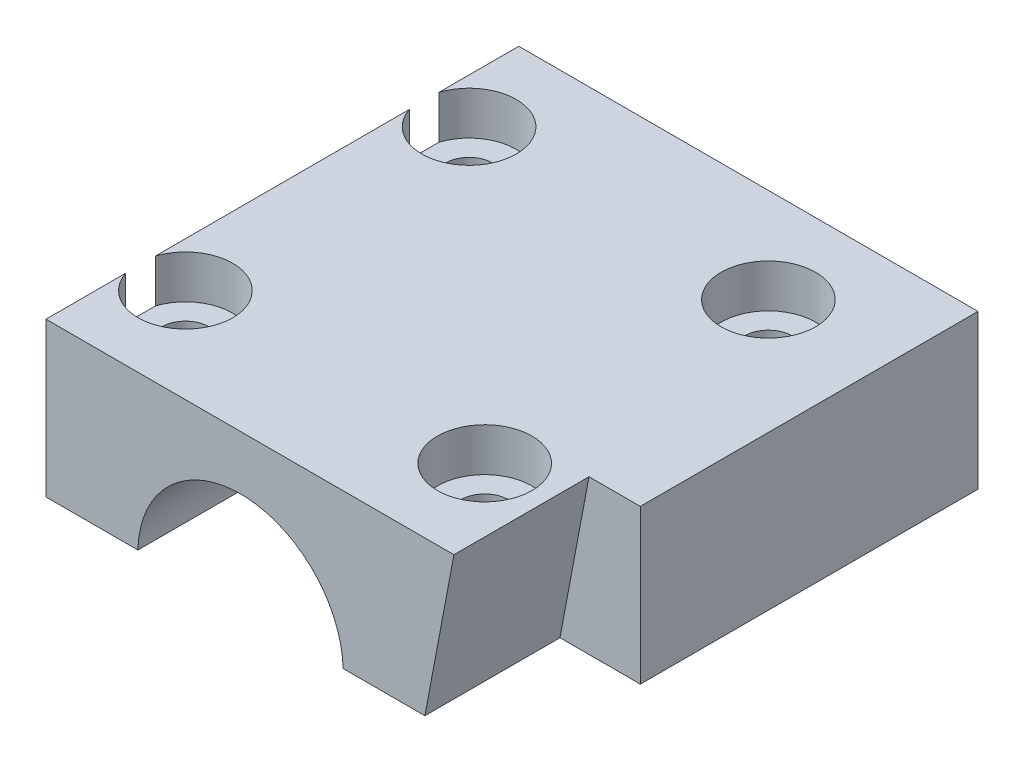
ISO-10303-21;
HEADER;
FILE_DESCRIPTION(('STEP AP214'),'2;1');
FILE_NAME('part.step','',(''),(''),'','','');
FILE_SCHEMA(('AUTOMOTIVE_DESIGN { 1 0 10303 214 1 1 1 1 }'));
ENDSEC;
DATA;
#1=APPLICATION_CONTEXT('core data for automotive mechanical design processes');
#2=APPLICATION_PROTOCOL_DEFINITION('international standard','automotive_design',2000,#1);
#3=PRODUCT_CONTEXT('',#1,'mechanical');
#4=PRODUCT('Part','Part','',(#3));
#5=PRODUCT_RELATED_PRODUCT_CATEGORY('part','',(#4));
#6=PRODUCT_DEFINITION_FORMATION('','',#4);
#7=PRODUCT_DEFINITION_CONTEXT('part definition',#1,'design');
#8=PRODUCT_DEFINITION('design','',#6,#7);
#9=PRODUCT_DEFINITION_SHAPE('','',#8);
#10=(LENGTH_UNIT() NAMED_UNIT(*) SI_UNIT(.MILLI.,.METRE.));
#11=(NAMED_UNIT(*) PLANE_ANGLE_UNIT() SI_UNIT($,.RADIAN.));
#12=(NAMED_UNIT(*) SI_UNIT($,.STERADIAN.) SOLID_ANGLE_UNIT());
#13=UNCERTAINTY_MEASURE_WITH_UNIT(LENGTH_MEASURE(1.E-05),#10,'distance_accuracy_value','');
#14=(GEOMETRIC_REPRESENTATION_CONTEXT(3) GLOBAL_UNCERTAINTY_ASSIGNED_CONTEXT((#13)) GLOBAL_UNIT_ASSIGNED_CONTEXT((#10,
#11,#12)) REPRESENTATION_CONTEXT('',''));
#15=CARTESIAN_POINT('',(0.,0.,0.));
#16=DIRECTION('',(0.,0.,1.));
#17=DIRECTION('',(1.,0.,0.));
#18=AXIS2_PLACEMENT_3D('',#15,#16,#17);
#19=CARTESIAN_POINT('',(149.649998,-25.85,-70.));
#20=DIRECTION('',(0.,0.,-1.));
#21=DIRECTION('',(-1.,0.,0.));
#22=AXIS2_PLACEMENT_3D('',#19,#20,#21);
#23=PLANE('',#22);
#24=CARTESIAN_POINT('',(147.049995999999,-31.65,-70.));
#25=DIRECTION('',(0.,0.,-1.));
#26=DIRECTION('',(-1.,0.,0.));
#27=AXIS2_PLACEMENT_3D('',#24,#25,#26);
#28=CIRCLE('',#27,7.6);
#29=CARTESIAN_POINT('',(139.452628034693,-31.4500000000005,-70.));
#30=VERTEX_POINT('',#29);
#31=CARTESIAN_POINT('',(154.647363965306,-31.4500000000006,-70.));
#32=VERTEX_POINT('',#31);
#33=EDGE_CURVE('E151',#30,#32,#28,.T.);
#34=ORIENTED_EDGE('',*,*,#33,.F.);
#35=DIRECTION('',(1.,0.,0.));
#36=VECTOR('',#35,1.);
#37=CARTESIAN_POINT('',(144.549997,-31.45,-70.));
#38=LINE('',#37,#36);
#39=CARTESIAN_POINT('',(132.65,-31.45,-70.));
#40=VERTEX_POINT('',#39);
#41=EDGE_CURVE('E276',#40,#30,#38,.T.);
#42=ORIENTED_EDGE('',*,*,#41,.F.);
#43=DIRECTION('',(0.,-1.,0.));
#44=VECTOR('',#43,1.);
#45=CARTESIAN_POINT('',(132.65,-28.75,-70.));
#46=LINE('',#45,#44);
#47=CARTESIAN_POINT('',(132.65,-20.05,-70.));
#48=VERTEX_POINT('',#47);
#49=EDGE_CURVE('E211',#48,#40,#46,.T.);
#50=ORIENTED_EDGE('',*,*,#49,.F.);
#51=DIRECTION('',(-1.,0.,0.));
#52=VECTOR('',#51,1.);
#53=CARTESIAN_POINT('',(141.149999,-20.05,-70.));
#54=LINE('',#53,#52);
#55=CARTESIAN_POINT('',(166.649995999999,-20.05,-70.));
#56=VERTEX_POINT('',#55);
#57=EDGE_CURVE('E229',#56,#48,#54,.T.);
#58=ORIENTED_EDGE('',*,*,#57,.F.);
#59=DIRECTION('',(0.,1.,0.));
#60=VECTOR('',#59,1.);
#61=CARTESIAN_POINT('',(166.649995999999,-22.95,-70.));
#62=LINE('',#61,#60);
#63=CARTESIAN_POINT('',(166.649995999999,-31.45,-70.));
#64=VERTEX_POINT('',#63);
#65=EDGE_CURVE('E207',#64,#56,#62,.T.);
#66=ORIENTED_EDGE('',*,*,#65,.F.);
#67=DIRECTION('',(1.,0.,0.));
#68=VECTOR('',#67,1.);
#69=CARTESIAN_POINT('',(158.149997,-31.45,-70.));
#70=LINE('',#69,#68);
#71=EDGE_CURVE('E11',#32,#64,#70,.T.);
#72=ORIENTED_EDGE('',*,*,#71,.F.);
#73=EDGE_LOOP('',(#34,#42,#50,#58,#66,#72));
#74=FACE_BOUND('',#73,.T.);
#75=ADVANCED_FACE('F17',(#74),#23,.T.);
#76=CARTESIAN_POINT('',(149.649998,-54.825,-34.9999999903543));
#77=DIRECTION('',(0.,0.,1.));
#78=DIRECTION('',(1.,0.,0.));
#79=AXIS2_PLACEMENT_3D('',#76,#77,#78);
#80=PLANE('',#79);
#81=DIRECTION('',(0.185269040092225,0.982687835878366,0.));
#82=VECTOR('',#81,1.);
#83=CARTESIAN_POINT('',(158.383219098092,-43.7422873077023,-34.9999999903544));
#84=LINE('',#83,#82);
#85=CARTESIAN_POINT('',(160.700720329803,-31.45,-34.9999999903346));
#86=VERTEX_POINT('',#85);
#87=CARTESIAN_POINT('',(162.849996,-20.05,-34.9999999903347));
#88=VERTEX_POINT('',#87);
#89=EDGE_CURVE('E350',#86,#88,#84,.T.);
#90=ORIENTED_EDGE('',*,*,#89,.T.);
#91=DIRECTION('',(-1.,0.,0.));
#92=VECTOR('',#91,1.);
#93=CARTESIAN_POINT('',(166.649996,-20.05,-35.));
#94=LINE('',#93,#92);
#95=CARTESIAN_POINT('',(132.65,-20.05,-35.));
#96=VERTEX_POINT('',#95);
#97=EDGE_CURVE('E260',#88,#96,#94,.T.);
#98=ORIENTED_EDGE('',*,*,#97,.T.);
#99=DIRECTION('',(0.,-1.,0.));
#100=VECTOR('',#99,1.);
#101=CARTESIAN_POINT('',(132.65,-20.05,-35.));
#102=LINE('',#101,#100);
#103=CARTESIAN_POINT('',(132.65,-31.45,-35.));
#104=VERTEX_POINT('',#103);
#105=EDGE_CURVE('E238',#96,#104,#102,.T.);
#106=ORIENTED_EDGE('',*,*,#105,.T.);
#107=DIRECTION('',(-1.,0.,0.));
#108=VECTOR('',#107,1.);
#109=CARTESIAN_POINT('',(144.549997,-31.45,-34.9999999903543));
#110=LINE('',#109,#108);
#111=CARTESIAN_POINT('',(139.452628034693,-31.4500000000005,-35.));
#112=VERTEX_POINT('',#111);
#113=EDGE_CURVE('E252',#112,#104,#110,.T.);
#114=ORIENTED_EDGE('',*,*,#113,.F.);
#115=CARTESIAN_POINT('',(147.049996,-31.65,-35.));
#116=DIRECTION('',(0.,0.,1.));
#117=DIRECTION('',(-1.,0.,0.));
#118=AXIS2_PLACEMENT_3D('',#115,#116,#117);
#119=CIRCLE('',#118,7.6);
#120=CARTESIAN_POINT('',(154.647363965306,-31.4500000000006,-35.));
#121=VERTEX_POINT('',#120);
#122=EDGE_CURVE('E140',#121,#112,#119,.T.);
#123=ORIENTED_EDGE('',*,*,#122,.F.);
#124=DIRECTION('',(1.,0.,0.));
#125=VECTOR('',#124,1.);
#126=CARTESIAN_POINT('',(158.149997,-31.45,-34.9999999903544));
#127=LINE('',#126,#125);
#128=EDGE_CURVE('E28',#121,#86,#127,.T.);
#129=ORIENTED_EDGE('',*,*,#128,.T.);
#130=EDGE_LOOP('',(#90,#98,#106,#114,#123,#129));
#131=FACE_BOUND('',#130,.T.);
#132=ADVANCED_FACE('F19',(#131),#80,.T.);
#133=CARTESIAN_POINT('',(166.649996,-31.45,-35.));
#134=DIRECTION('',(0.,-1.,0.));
#135=DIRECTION('',(-1.,0.,0.));
#136=AXIS2_PLACEMENT_3D('',#133,#134,#135);
#137=PLANE('',#136);
#138=CARTESIAN_POINT('',(158.128590856567,-31.45,-42.));
#139=DIRECTION('',(0.,1.,0.));
#140=DIRECTION('',(-1.,0.,0.));
#141=AXIS2_PLACEMENT_3D('',#138,#139,#140);
#142=CIRCLE('',#141,1.75);
#143=CARTESIAN_POINT('',(159.878590856567,-31.45,-42.));
#144=VERTEX_POINT('',#143);
#145=EDGE_CURVE('E321',#144,#144,#142,.T.);
#146=ORIENTED_EDGE('',*,*,#145,.T.);
#147=EDGE_LOOP('',(#146));
#148=FACE_BOUND('',#147,.T.);
#149=CARTESIAN_POINT('',(158.128590856568,-31.45,-63.));
#150=DIRECTION('',(0.,1.,0.));
#151=DIRECTION('',(-1.,0.,0.));
#152=AXIS2_PLACEMENT_3D('',#149,#150,#151);
#153=CIRCLE('',#152,1.75);
#154=CARTESIAN_POINT('',(159.878590856568,-31.45,-63.));
#155=VERTEX_POINT('',#154);
#156=EDGE_CURVE('E251',#155,#155,#153,.T.);
#157=ORIENTED_EDGE('',*,*,#156,.T.);
#158=EDGE_LOOP('',(#157));
#159=FACE_BOUND('',#158,.T.);
#160=DIRECTION('',(0.,0.,1.));
#161=VECTOR('',#160,1.);
#162=CARTESIAN_POINT('',(160.700720329803,-31.45,-34.9999999951673));
#163=LINE('',#162,#161);
#164=CARTESIAN_POINT('',(160.700720329802,-31.45,-44.9999999903346));
#165=VERTEX_POINT('',#164);
#166=EDGE_CURVE('E354',#165,#86,#163,.T.);
#167=ORIENTED_EDGE('',*,*,#166,.T.);
#168=ORIENTED_EDGE('',*,*,#128,.F.);
#169=DIRECTION('',(0.,0.,-1.));
#170=VECTOR('',#169,1.);
#171=CARTESIAN_POINT('',(154.647363965289,-31.45,-35.));
#172=LINE('',#171,#170);
#173=EDGE_CURVE('E283',#121,#32,#172,.T.);
#174=ORIENTED_EDGE('',*,*,#173,.T.);
#175=ORIENTED_EDGE('',*,*,#71,.T.);
#176=DIRECTION('',(0.,0.,-1.));
#177=VECTOR('',#176,1.);
#178=CARTESIAN_POINT('',(166.649996,-31.45,-35.));
#179=LINE('',#178,#177);
#180=CARTESIAN_POINT('',(166.649996000001,-31.45,-44.999999990335));
#181=VERTEX_POINT('',#180);
#182=EDGE_CURVE('E286',#181,#64,#179,.T.);
#183=ORIENTED_EDGE('',*,*,#182,.F.);
#184=DIRECTION('',(-1.,0.,0.));
#185=VECTOR('',#184,1.);
#186=CARTESIAN_POINT('',(223.31267608245,-31.45,-44.9999999903389));
#187=LINE('',#186,#185);
#188=EDGE_CURVE('E223',#181,#165,#187,.T.);
#189=ORIENTED_EDGE('',*,*,#188,.T.);
#190=EDGE_LOOP('',(#167,#168,#174,#175,#183,#189));
#191=FACE_BOUND('',#190,.T.);
#192=ADVANCED_FACE('F395',(#148,#159,#191),#137,.T.);
#193=CARTESIAN_POINT('',(147.049996,-31.65,-35.));
#194=DIRECTION('',(0.,0.,-1.));
#195=DIRECTION('',(-1.,0.,0.));
#196=AXIS2_PLACEMENT_3D('',#193,#194,#195);
#197=CYLINDRICAL_SURFACE('',#196,7.6);
#198=ORIENTED_EDGE('',*,*,#33,.T.);
#199=ORIENTED_EDGE('',*,*,#173,.F.);
#200=ORIENTED_EDGE('',*,*,#122,.T.);
#201=DIRECTION('',(0.,0.,-1.));
#202=VECTOR('',#201,1.);
#203=CARTESIAN_POINT('',(139.452628034711,-31.45,-35.));
#204=LINE('',#203,#202);
#205=EDGE_CURVE('E254',#112,#30,#204,.T.);
#206=ORIENTED_EDGE('',*,*,#205,.T.);
#207=EDGE_LOOP('',(#198,#199,#200,#206));
#208=FACE_BOUND('',#207,.T.);
#209=ADVANCED_FACE('F409',(#208),#197,.F.);
#210=CARTESIAN_POINT('',(139.449996,-31.45,-35.));
#211=DIRECTION('',(0.,-1.,0.));
#212=DIRECTION('',(-1.,0.,0.));
#213=AXIS2_PLACEMENT_3D('',#210,#211,#212);
#214=PLANE('',#213);
#215=CARTESIAN_POINT('',(135.971401143432,-31.45,-42.0000000000016));
#216=DIRECTION('',(0.,1.,0.));
#217=DIRECTION('',(-1.,0.,0.));
#218=AXIS2_PLACEMENT_3D('',#215,#216,#217);
#219=CIRCLE('',#218,1.75);
#220=CARTESIAN_POINT('',(137.721401143432,-31.45,-42.0000000000016));
#221=VERTEX_POINT('',#220);
#222=EDGE_CURVE('E280',#221,#221,#219,.T.);
#223=ORIENTED_EDGE('',*,*,#222,.T.);
#224=EDGE_LOOP('',(#223));
#225=FACE_BOUND('',#224,.T.);
#226=CARTESIAN_POINT('',(135.971401143431,-31.45,-63.));
#227=DIRECTION('',(0.,1.,0.));
#228=DIRECTION('',(-1.,0.,0.));
#229=AXIS2_PLACEMENT_3D('',#226,#227,#228);
#230=CIRCLE('',#229,1.75);
#231=CARTESIAN_POINT('',(137.721401143431,-31.45,-63.));
#232=VERTEX_POINT('',#231);
#233=EDGE_CURVE('E316',#232,#232,#230,.T.);
#234=ORIENTED_EDGE('',*,*,#233,.T.);
#235=EDGE_LOOP('',(#234));
#236=FACE_BOUND('',#235,.T.);
#237=ORIENTED_EDGE('',*,*,#41,.T.);
#238=ORIENTED_EDGE('',*,*,#205,.F.);
#239=ORIENTED_EDGE('',*,*,#113,.T.);
#240=DIRECTION('',(0.,0.,-1.));
#241=VECTOR('',#240,1.);
#242=CARTESIAN_POINT('',(132.65,-31.45,-35.));
#243=LINE('',#242,#241);
#244=EDGE_CURVE('E234',#104,#40,#243,.T.);
#245=ORIENTED_EDGE('',*,*,#244,.T.);
#246=EDGE_LOOP('',(#237,#238,#239,#245));
#247=FACE_BOUND('',#246,.T.);
#248=ADVANCED_FACE('F411',(#225,#236,#247),#214,.T.);
#249=CARTESIAN_POINT('',(135.971401143432,-20.05,-42.0000000000016));
#250=DIRECTION('',(0.,-1.,0.));
#251=DIRECTION('',(-1.,0.,0.));
#252=AXIS2_PLACEMENT_3D('',#249,#250,#251);
#253=CYLINDRICAL_SURFACE('',#252,1.75);
#254=CARTESIAN_POINT('',(135.971401143432,-23.2499953703008,-42.0000000000016));
#255=DIRECTION('',(0.,1.,0.));
#256=DIRECTION('',(-1.,0.,0.));
#257=AXIS2_PLACEMENT_3D('',#254,#255,#256);
#258=CIRCLE('',#257,1.75);
#259=CARTESIAN_POINT('',(137.721401143432,-23.25,-42.0000000000016));
#260=VERTEX_POINT('',#259);
#261=EDGE_CURVE('E270',#260,#260,#258,.T.);
#262=ORIENTED_EDGE('',*,*,#261,.T.);
#263=DIRECTION('',(0.,-1.,0.));
#264=VECTOR('',#263,1.);
#265=CARTESIAN_POINT('',(137.721401143432,-20.05,-42.0000000000016));
#266=LINE('',#265,#264);
#267=EDGE_CURVE('E312',#260,#221,#266,.T.);
#268=ORIENTED_EDGE('',*,*,#267,.T.);
#269=ORIENTED_EDGE('',*,*,#222,.F.);
#270=ORIENTED_EDGE('',*,*,#267,.F.);
#271=EDGE_LOOP('',(#262,#268,#269,#270));
#272=FACE_BOUND('',#271,.T.);
#273=ADVANCED_FACE('F564',(#272),#253,.F.);
#274=CARTESIAN_POINT('',(135.971401143431,-20.05,-63.));
#275=DIRECTION('',(0.,-1.,0.));
#276=DIRECTION('',(-1.,0.,0.));
#277=AXIS2_PLACEMENT_3D('',#274,#275,#276);
#278=CYLINDRICAL_SURFACE('',#277,1.75);
#279=CARTESIAN_POINT('',(135.971401143431,-23.2499953703008,-63.));
#280=DIRECTION('',(0.,1.,0.));
#281=DIRECTION('',(-1.,0.,0.));
#282=AXIS2_PLACEMENT_3D('',#279,#280,#281);
#283=CIRCLE('',#282,1.75);
#284=CARTESIAN_POINT('',(137.721401143431,-23.25,-63.));
#285=VERTEX_POINT('',#284);
#286=EDGE_CURVE('E218',#285,#285,#283,.T.);
#287=ORIENTED_EDGE('',*,*,#286,.T.);
#288=DIRECTION('',(0.,-1.,0.));
#289=VECTOR('',#288,1.);
#290=CARTESIAN_POINT('',(137.721401143431,-20.05,-63.));
#291=LINE('',#290,#289);
#292=EDGE_CURVE('E344',#285,#232,#291,.T.);
#293=ORIENTED_EDGE('',*,*,#292,.T.);
#294=ORIENTED_EDGE('',*,*,#233,.F.);
#295=ORIENTED_EDGE('',*,*,#292,.F.);
#296=EDGE_LOOP('',(#287,#293,#294,#295));
#297=FACE_BOUND('',#296,.T.);
#298=ADVANCED_FACE('F558',(#297),#278,.F.);
#299=CARTESIAN_POINT('',(158.128590856567,-20.05,-42.));
#300=DIRECTION('',(0.,-1.,0.));
#301=DIRECTION('',(-1.,0.,0.));
#302=AXIS2_PLACEMENT_3D('',#299,#300,#301);
#303=CYLINDRICAL_SURFACE('',#302,1.75);
#304=CARTESIAN_POINT('',(158.128590856567,-23.2499953703008,-42.));
#305=DIRECTION('',(0.,1.,0.));
#306=DIRECTION('',(-1.,0.,0.));
#307=AXIS2_PLACEMENT_3D('',#304,#305,#306);
#308=CIRCLE('',#307,1.75);
#309=CARTESIAN_POINT('',(159.878590856567,-23.25,-42.));
#310=VERTEX_POINT('',#309);
#311=EDGE_CURVE('E324',#310,#310,#308,.T.);
#312=ORIENTED_EDGE('',*,*,#311,.T.);
#313=DIRECTION('',(0.,-1.,0.));
#314=VECTOR('',#313,1.);
#315=CARTESIAN_POINT('',(159.878590856567,-20.05,-42.));
#316=LINE('',#315,#314);
#317=EDGE_CURVE('E317',#310,#144,#316,.T.);
#318=ORIENTED_EDGE('',*,*,#317,.T.);
#319=ORIENTED_EDGE('',*,*,#145,.F.);
#320=ORIENTED_EDGE('',*,*,#317,.F.);
#321=EDGE_LOOP('',(#312,#318,#319,#320));
#322=FACE_BOUND('',#321,.T.);
#323=ADVANCED_FACE('F563',(#322),#303,.F.);
#324=CARTESIAN_POINT('',(158.128590856568,-20.05,-63.));
#325=DIRECTION('',(0.,-1.,0.));
#326=DIRECTION('',(-1.,0.,0.));
#327=AXIS2_PLACEMENT_3D('',#324,#325,#326);
#328=CYLINDRICAL_SURFACE('',#327,1.75);
#329=CARTESIAN_POINT('',(158.128590856568,-23.2499953703008,-63.));
#330=DIRECTION('',(0.,1.,0.));
#331=DIRECTION('',(-1.,0.,0.));
#332=AXIS2_PLACEMENT_3D('',#329,#330,#331);
#333=CIRCLE('',#332,1.75);
#334=CARTESIAN_POINT('',(159.878590856568,-23.25,-63.));
#335=VERTEX_POINT('',#334);
#336=EDGE_CURVE('E197',#335,#335,#333,.T.);
#337=ORIENTED_EDGE('',*,*,#336,.T.);
#338=DIRECTION('',(0.,-1.,0.));
#339=VECTOR('',#338,1.);
#340=CARTESIAN_POINT('',(159.878590856568,-20.05,-63.));
#341=LINE('',#340,#339);
#342=EDGE_CURVE('E247',#335,#155,#341,.T.);
#343=ORIENTED_EDGE('',*,*,#342,.T.);
#344=ORIENTED_EDGE('',*,*,#156,.F.);
#345=ORIENTED_EDGE('',*,*,#342,.F.);
#346=EDGE_LOOP('',(#337,#343,#344,#345));
#347=FACE_BOUND('',#346,.T.);
#348=ADVANCED_FACE('F552',(#347),#328,.F.);
#349=CARTESIAN_POINT('',(132.65,-31.65,-35.));
#350=DIRECTION('',(-1.,0.,0.));
#351=DIRECTION('',(0.,1.,0.));
#352=AXIS2_PLACEMENT_3D('',#349,#350,#351);
#353=PLANE('',#352);
#354=DIRECTION('',(0.,-1.,0.));
#355=VECTOR('',#354,1.);
#356=CARTESIAN_POINT('',(132.65,-20.05,-40.8962362370472));
#357=LINE('',#356,#355);
#358=CARTESIAN_POINT('',(132.65,-20.05,-40.8962362370472));
#359=VERTEX_POINT('',#358);
#360=CARTESIAN_POINT('',(132.65,-23.25,-40.8962362370472));
#361=VERTEX_POINT('',#360);
#362=EDGE_CURVE('E299',#359,#361,#357,.T.);
#363=ORIENTED_EDGE('',*,*,#362,.T.);
#364=DIRECTION('',(0.,0.,-1.));
#365=VECTOR('',#364,1.);
#366=CARTESIAN_POINT('',(132.65,-23.2499953703008,-43.75));
#367=LINE('',#366,#365);
#368=CARTESIAN_POINT('',(132.65,-23.25,-43.103763762956));
#369=VERTEX_POINT('',#368);
#370=EDGE_CURVE('E275',#361,#369,#367,.T.);
#371=ORIENTED_EDGE('',*,*,#370,.T.);
#372=DIRECTION('',(0.,1.,0.));
#373=VECTOR('',#372,1.);
#374=CARTESIAN_POINT('',(132.65,-20.05,-43.103763762956));
#375=LINE('',#374,#373);
#376=CARTESIAN_POINT('',(132.65,-20.05,-43.103763762956));
#377=VERTEX_POINT('',#376);
#378=EDGE_CURVE('E205',#369,#377,#375,.T.);
#379=ORIENTED_EDGE('',*,*,#378,.T.);
#380=DIRECTION('',(0.,0.,-1.));
#381=VECTOR('',#380,1.);
#382=CARTESIAN_POINT('',(132.65,-20.05,-35.));
#383=LINE('',#382,#381);
#384=CARTESIAN_POINT('',(132.65,-20.05,-61.8962362370457));
#385=VERTEX_POINT('',#384);
#386=EDGE_CURVE('E269',#377,#385,#383,.T.);
#387=ORIENTED_EDGE('',*,*,#386,.T.);
#388=DIRECTION('',(0.,-1.,0.));
#389=VECTOR('',#388,1.);
#390=CARTESIAN_POINT('',(132.65,-20.05,-61.8962362370457));
#391=LINE('',#390,#389);
#392=CARTESIAN_POINT('',(132.65,-23.25,-61.8962362370457));
#393=VERTEX_POINT('',#392);
#394=EDGE_CURVE('E239',#385,#393,#391,.T.);
#395=ORIENTED_EDGE('',*,*,#394,.T.);
#396=DIRECTION('',(0.,0.,-1.));
#397=VECTOR('',#396,1.);
#398=CARTESIAN_POINT('',(132.65,-23.2499953703008,-43.75));
#399=LINE('',#398,#397);
#400=CARTESIAN_POINT('',(132.65,-23.25,-64.1037637629545));
#401=VERTEX_POINT('',#400);
#402=EDGE_CURVE('E243',#393,#401,#399,.T.);
#403=ORIENTED_EDGE('',*,*,#402,.T.);
#404=DIRECTION('',(0.,1.,0.));
#405=VECTOR('',#404,1.);
#406=CARTESIAN_POINT('',(132.65,-20.05,-64.1037637629545));
#407=LINE('',#406,#405);
#408=CARTESIAN_POINT('',(132.65,-20.05,-64.1037637629545));
#409=VERTEX_POINT('',#408);
#410=EDGE_CURVE('E274',#401,#409,#407,.T.);
#411=ORIENTED_EDGE('',*,*,#410,.T.);
#412=DIRECTION('',(0.,0.,-1.));
#413=VECTOR('',#412,1.);
#414=CARTESIAN_POINT('',(132.65,-20.05,-35.));
#415=LINE('',#414,#413);
#416=EDGE_CURVE('E233',#409,#48,#415,.T.);
#417=ORIENTED_EDGE('',*,*,#416,.T.);
#418=ORIENTED_EDGE('',*,*,#49,.T.);
#419=ORIENTED_EDGE('',*,*,#244,.F.);
#420=ORIENTED_EDGE('',*,*,#105,.F.);
#421=DIRECTION('',(0.,0.,-1.));
#422=VECTOR('',#421,1.);
#423=CARTESIAN_POINT('',(132.65,-20.05,-35.));
#424=LINE('',#423,#422);
#425=EDGE_CURVE('E256',#96,#359,#424,.T.);
#426=ORIENTED_EDGE('',*,*,#425,.T.);
#427=EDGE_LOOP('',(#363,#371,#379,#387,#395,#403,#411,#417,#418,#419,#420,#426));
#428=FACE_BOUND('',#427,.T.);
#429=ADVANCED_FACE('F379',(#428),#353,.T.);
#430=CARTESIAN_POINT('',(149.560698571716,-23.2499953703008,-52.5));
#431=DIRECTION('',(0.,1.,0.));
#432=DIRECTION('',(1.,0.,0.));
#433=AXIS2_PLACEMENT_3D('',#430,#431,#432);
#434=PLANE('',#433);
#435=ORIENTED_EDGE('',*,*,#311,.F.);
#436=EDGE_LOOP('',(#435));
#437=FACE_BOUND('',#436,.T.);
#438=CARTESIAN_POINT('',(158.128590856567,-23.25,-42.));
#439=DIRECTION('',(0.,-1.,0.));
#440=DIRECTION('',(-1.,0.,0.));
#441=AXIS2_PLACEMENT_3D('',#438,#439,#440);
#442=CIRCLE('',#441,3.5);
#443=CARTESIAN_POINT('',(161.628590856567,-23.25,-42.));
#444=VERTEX_POINT('',#443);
#445=EDGE_CURVE('E217',#444,#444,#442,.T.);
#446=ORIENTED_EDGE('',*,*,#445,.F.);
#447=EDGE_LOOP('',(#446));
#448=FACE_BOUND('',#447,.T.);
#449=ADVANCED_FACE('F551',(#437,#448),#434,.T.);
#450=CARTESIAN_POINT('',(158.128590856567,-20.05,-42.));
#451=DIRECTION('',(0.,-1.,0.));
#452=DIRECTION('',(-1.,0.,0.));
#453=AXIS2_PLACEMENT_3D('',#450,#451,#452);
#454=CYLINDRICAL_SURFACE('',#453,3.5);
#455=CARTESIAN_POINT('',(158.128590856567,-20.05,-42.));
#456=DIRECTION('',(0.,-1.,0.));
#457=DIRECTION('',(-1.,0.,0.));
#458=AXIS2_PLACEMENT_3D('',#455,#456,#457);
#459=CIRCLE('',#458,3.5);
#460=CARTESIAN_POINT('',(161.628590856567,-20.05,-42.));
#461=VERTEX_POINT('',#460);
#462=EDGE_CURVE('E291',#461,#461,#459,.T.);
#463=ORIENTED_EDGE('',*,*,#462,.F.);
#464=DIRECTION('',(0.,-1.,0.));
#465=VECTOR('',#464,1.);
#466=CARTESIAN_POINT('',(161.628590856567,-20.05,-42.));
#467=LINE('',#466,#465);
#468=EDGE_CURVE('E213',#461,#444,#467,.T.);
#469=ORIENTED_EDGE('',*,*,#468,.T.);
#470=ORIENTED_EDGE('',*,*,#445,.T.);
#471=ORIENTED_EDGE('',*,*,#468,.F.);
#472=EDGE_LOOP('',(#463,#469,#470,#471));
#473=FACE_BOUND('',#472,.T.);
#474=ADVANCED_FACE('F651',(#473),#454,.F.);
#475=CARTESIAN_POINT('',(149.560698571716,-23.2499953703008,-52.5));
#476=DIRECTION('',(0.,1.,0.));
#477=DIRECTION('',(1.,0.,0.));
#478=AXIS2_PLACEMENT_3D('',#475,#476,#477);
#479=PLANE('',#478);
#480=ORIENTED_EDGE('',*,*,#286,.F.);
#481=EDGE_LOOP('',(#480));
#482=FACE_BOUND('',#481,.T.);
#483=CARTESIAN_POINT('',(135.971401143431,-23.25,-63.));
#484=DIRECTION('',(0.,-1.,0.));
#485=DIRECTION('',(-1.,0.,0.));
#486=AXIS2_PLACEMENT_3D('',#483,#484,#485);
#487=CIRCLE('',#486,3.5);
#488=EDGE_CURVE('E244',#401,#393,#487,.T.);
#489=ORIENTED_EDGE('',*,*,#488,.F.);
#490=ORIENTED_EDGE('',*,*,#402,.F.);
#491=EDGE_LOOP('',(#489,#490));
#492=FACE_BOUND('',#491,.T.);
#493=ADVANCED_FACE('F667',(#482,#492),#479,.T.);
#494=CARTESIAN_POINT('',(135.971401143431,-20.05,-63.));
#495=DIRECTION('',(0.,-1.,0.));
#496=DIRECTION('',(1.,0.,0.));
#497=AXIS2_PLACEMENT_3D('',#494,#495,#496);
#498=CYLINDRICAL_SURFACE('',#497,3.5);
#499=CARTESIAN_POINT('',(135.971401143431,-20.05,-63.));
#500=DIRECTION('',(0.,-1.,0.));
#501=DIRECTION('',(-1.,0.,0.));
#502=AXIS2_PLACEMENT_3D('',#499,#500,#501);
#503=CIRCLE('',#502,3.5);
#504=EDGE_CURVE('E265',#409,#385,#503,.T.);
#505=ORIENTED_EDGE('',*,*,#504,.F.);
#506=ORIENTED_EDGE('',*,*,#410,.F.);
#507=ORIENTED_EDGE('',*,*,#488,.T.);
#508=ORIENTED_EDGE('',*,*,#394,.F.);
#509=EDGE_LOOP('',(#505,#506,#507,#508));
#510=FACE_BOUND('',#509,.T.);
#511=ADVANCED_FACE('F384',(#510),#498,.F.);
#512=CARTESIAN_POINT('',(149.560698571716,-23.2499953703008,-52.5));
#513=DIRECTION('',(0.,1.,0.));
#514=DIRECTION('',(1.,0.,0.));
#515=AXIS2_PLACEMENT_3D('',#512,#513,#514);
#516=PLANE('',#515);
#517=ORIENTED_EDGE('',*,*,#261,.F.);
#518=EDGE_LOOP('',(#517));
#519=FACE_BOUND('',#518,.T.);
#520=ORIENTED_EDGE('',*,*,#370,.F.);
#521=CARTESIAN_POINT('',(135.971401143432,-23.25,-42.0000000000016));
#522=DIRECTION('',(0.,-1.,0.));
#523=DIRECTION('',(-1.,0.,0.));
#524=AXIS2_PLACEMENT_3D('',#521,#522,#523);
#525=CIRCLE('',#524,3.5);
#526=EDGE_CURVE('E295',#369,#361,#525,.T.);
#527=ORIENTED_EDGE('',*,*,#526,.F.);
#528=EDGE_LOOP('',(#520,#527));
#529=FACE_BOUND('',#528,.T.);
#530=ADVANCED_FACE('F571',(#519,#529),#516,.T.);
#531=CARTESIAN_POINT('',(135.971401143432,-20.05,-42.0000000000016));
#532=DIRECTION('',(0.,-1.,0.));
#533=DIRECTION('',(1.,0.,0.));
#534=AXIS2_PLACEMENT_3D('',#531,#532,#533);
#535=CYLINDRICAL_SURFACE('',#534,3.5);
#536=CARTESIAN_POINT('',(135.971401143432,-20.05,-42.0000000000016));
#537=DIRECTION('',(0.,-1.,0.));
#538=DIRECTION('',(-1.,0.,0.));
#539=AXIS2_PLACEMENT_3D('',#536,#537,#538);
#540=CIRCLE('',#539,3.5);
#541=EDGE_CURVE('E261',#377,#359,#540,.T.);
#542=ORIENTED_EDGE('',*,*,#541,.F.);
#543=ORIENTED_EDGE('',*,*,#378,.F.);
#544=ORIENTED_EDGE('',*,*,#526,.T.);
#545=ORIENTED_EDGE('',*,*,#362,.F.);
#546=EDGE_LOOP('',(#542,#543,#544,#545));
#547=FACE_BOUND('',#546,.T.);
#548=ADVANCED_FACE('F576',(#547),#535,.F.);
#549=CARTESIAN_POINT('',(149.560698571716,-23.2499953703008,-52.5));
#550=DIRECTION('',(0.,1.,0.));
#551=DIRECTION('',(1.,0.,0.));
#552=AXIS2_PLACEMENT_3D('',#549,#550,#551);
#553=PLANE('',#552);
#554=ORIENTED_EDGE('',*,*,#336,.F.);
#555=EDGE_LOOP('',(#554));
#556=FACE_BOUND('',#555,.T.);
#557=CARTESIAN_POINT('',(158.128590856568,-23.25,-63.));
#558=DIRECTION('',(0.,-1.,0.));
#559=DIRECTION('',(-1.,0.,0.));
#560=AXIS2_PLACEMENT_3D('',#557,#558,#559);
#561=CIRCLE('',#560,3.5);
#562=CARTESIAN_POINT('',(161.628590856568,-23.25,-63.));
#563=VERTEX_POINT('',#562);
#564=EDGE_CURVE('E190',#563,#563,#561,.T.);
#565=ORIENTED_EDGE('',*,*,#564,.F.);
#566=EDGE_LOOP('',(#565));
#567=FACE_BOUND('',#566,.T.);
#568=ADVANCED_FACE('F623',(#556,#567),#553,.T.);
#569=CARTESIAN_POINT('',(158.128590856568,-20.05,-63.));
#570=DIRECTION('',(0.,-1.,0.));
#571=DIRECTION('',(-1.,0.,0.));
#572=AXIS2_PLACEMENT_3D('',#569,#570,#571);
#573=CYLINDRICAL_SURFACE('',#572,3.5);
#574=CARTESIAN_POINT('',(158.128590856568,-20.05,-63.));
#575=DIRECTION('',(0.,-1.,0.));
#576=DIRECTION('',(-1.,0.,0.));
#577=AXIS2_PLACEMENT_3D('',#574,#575,#576);
#578=CIRCLE('',#577,3.5);
#579=CARTESIAN_POINT('',(161.628590856568,-20.05,-63.));
#580=VERTEX_POINT('',#579);
#581=EDGE_CURVE('E290',#580,#580,#578,.T.);
#582=ORIENTED_EDGE('',*,*,#581,.F.);
#583=DIRECTION('',(0.,-1.,0.));
#584=VECTOR('',#583,1.);
#585=CARTESIAN_POINT('',(161.628590856568,-20.05,-63.));
#586=LINE('',#585,#584);
#587=EDGE_CURVE('E193',#580,#563,#586,.T.);
#588=ORIENTED_EDGE('',*,*,#587,.T.);
#589=ORIENTED_EDGE('',*,*,#564,.T.);
#590=ORIENTED_EDGE('',*,*,#587,.F.);
#591=EDGE_LOOP('',(#582,#588,#589,#590));
#592=FACE_BOUND('',#591,.T.);
#593=ADVANCED_FACE('F192',(#592),#573,.F.);
#594=CARTESIAN_POINT('',(166.649996,-20.05,-35.));
#595=DIRECTION('',(1.,0.,0.));
#596=DIRECTION('',(0.,0.,-1.));
#597=AXIS2_PLACEMENT_3D('',#594,#595,#596);
#598=PLANE('',#597);
#599=DIRECTION('',(0.,-1.,0.));
#600=VECTOR('',#599,1.);
#601=CARTESIAN_POINT('',(166.649996,-37.4375,-44.999999990335));
#602=LINE('',#601,#600);
#603=CARTESIAN_POINT('',(166.649995999999,-20.05,-44.999999990335));
#604=VERTEX_POINT('',#603);
#605=EDGE_CURVE('E224',#604,#181,#602,.T.);
#606=ORIENTED_EDGE('',*,*,#605,.T.);
#607=ORIENTED_EDGE('',*,*,#182,.T.);
#608=ORIENTED_EDGE('',*,*,#65,.T.);
#609=DIRECTION('',(0.,0.,-1.));
#610=VECTOR('',#609,1.);
#611=CARTESIAN_POINT('',(166.649996,-20.05,-35.));
#612=LINE('',#611,#610);
#613=EDGE_CURVE('E225',#604,#56,#612,.T.);
#614=ORIENTED_EDGE('',*,*,#613,.F.);
#615=EDGE_LOOP('',(#606,#607,#608,#614));
#616=FACE_BOUND('',#615,.T.);
#617=ADVANCED_FACE('F392',(#616),#598,.T.);
#618=CARTESIAN_POINT('',(132.65,-20.05,-35.));
#619=DIRECTION('',(0.,1.,0.));
#620=DIRECTION('',(1.,0.,0.));
#621=AXIS2_PLACEMENT_3D('',#618,#619,#620);
#622=PLANE('',#621);
#623=ORIENTED_EDGE('',*,*,#581,.T.);
#624=EDGE_LOOP('',(#623));
#625=FACE_BOUND('',#624,.T.);
#626=ORIENTED_EDGE('',*,*,#462,.T.);
#627=EDGE_LOOP('',(#626));
#628=FACE_BOUND('',#627,.T.);
#629=DIRECTION('',(0.,0.,-1.));
#630=VECTOR('',#629,1.);
#631=CARTESIAN_POINT('',(162.849996,-20.05,-34.9999999951685));
#632=LINE('',#631,#630);
#633=CARTESIAN_POINT('',(162.849995999999,-20.05,-44.9999999903347));
#634=VERTEX_POINT('',#633);
#635=EDGE_CURVE('E311',#88,#634,#632,.T.);
#636=ORIENTED_EDGE('',*,*,#635,.T.);
#637=DIRECTION('',(1.,0.,0.));
#638=VECTOR('',#637,1.);
#639=CARTESIAN_POINT('',(206.31267808245,-20.05,-44.9999999903378));
#640=LINE('',#639,#638);
#641=EDGE_CURVE('E219',#634,#604,#640,.T.);
#642=ORIENTED_EDGE('',*,*,#641,.T.);
#643=ORIENTED_EDGE('',*,*,#613,.T.);
#644=ORIENTED_EDGE('',*,*,#57,.T.);
#645=ORIENTED_EDGE('',*,*,#416,.F.);
#646=ORIENTED_EDGE('',*,*,#504,.T.);
#647=ORIENTED_EDGE('',*,*,#386,.F.);
#648=ORIENTED_EDGE('',*,*,#541,.T.);
#649=ORIENTED_EDGE('',*,*,#425,.F.);
#650=ORIENTED_EDGE('',*,*,#97,.F.);
#651=EDGE_LOOP('',(#636,#642,#643,#644,#645,#646,#647,#648,#649,#650));
#652=FACE_BOUND('',#651,.T.);
#653=ADVANCED_FACE('F387',(#625,#628,#652),#622,.T.);
#654=CARTESIAN_POINT('',(279.975356164901,-54.8250000000007,-44.9999999903428));
#655=DIRECTION('',(0.,0.,-1.));
#656=DIRECTION('',(-1.,0.,0.));
#657=AXIS2_PLACEMENT_3D('',#654,#655,#656);
#658=PLANE('',#657);
#659=ORIENTED_EDGE('',*,*,#605,.F.);
#660=ORIENTED_EDGE('',*,*,#641,.F.);
#661=DIRECTION('',(0.185269040092225,0.982687835878366,0.));
#662=VECTOR('',#661,1.);
#663=CARTESIAN_POINT('',(162.849995999999,-20.05,-44.9999999903347));
#664=LINE('',#663,#662);
#665=EDGE_CURVE('E21',#165,#634,#664,.T.);
#666=ORIENTED_EDGE('',*,*,#665,.F.);
#667=ORIENTED_EDGE('',*,*,#188,.F.);
#668=EDGE_LOOP('',(#659,#660,#666,#667));
#669=FACE_BOUND('',#668,.T.);
#670=ADVANCED_FACE('F398',(#669),#658,.F.);
#671=CARTESIAN_POINT('',(160.700720329803,-31.45,-34.9999999903346));
#672=DIRECTION('',(-0.982687835878366,0.185269040092225,0.));
#673=DIRECTION('',(0.,0.,1.));
#674=AXIS2_PLACEMENT_3D('',#671,#672,#673);
#675=PLANE('',#674);
#676=ORIENTED_EDGE('',*,*,#89,.F.);
#677=ORIENTED_EDGE('',*,*,#166,.F.);
#678=ORIENTED_EDGE('',*,*,#665,.T.);
#679=ORIENTED_EDGE('',*,*,#635,.F.);
#680=EDGE_LOOP('',(#676,#677,#678,#679));
#681=FACE_BOUND('',#680,.T.);
#682=ADVANCED_FACE('F405',(#681),#675,.F.);
#683=CLOSED_SHELL('',(#75,#132,#192,#209,#248,#273,#298,#323,#348,#429,#449,#474,#493,#511,#530,
#548,#568,#593,#617,#653,#670,#682));
#684=MANIFOLD_SOLID_BREP('B1',#683);
#685=ADVANCED_BREP_SHAPE_REPRESENTATION('',(#18,#684),#14);
#686=SHAPE_DEFINITION_REPRESENTATION(#9,#685);
ENDSEC;
END-ISO-10303-21;
